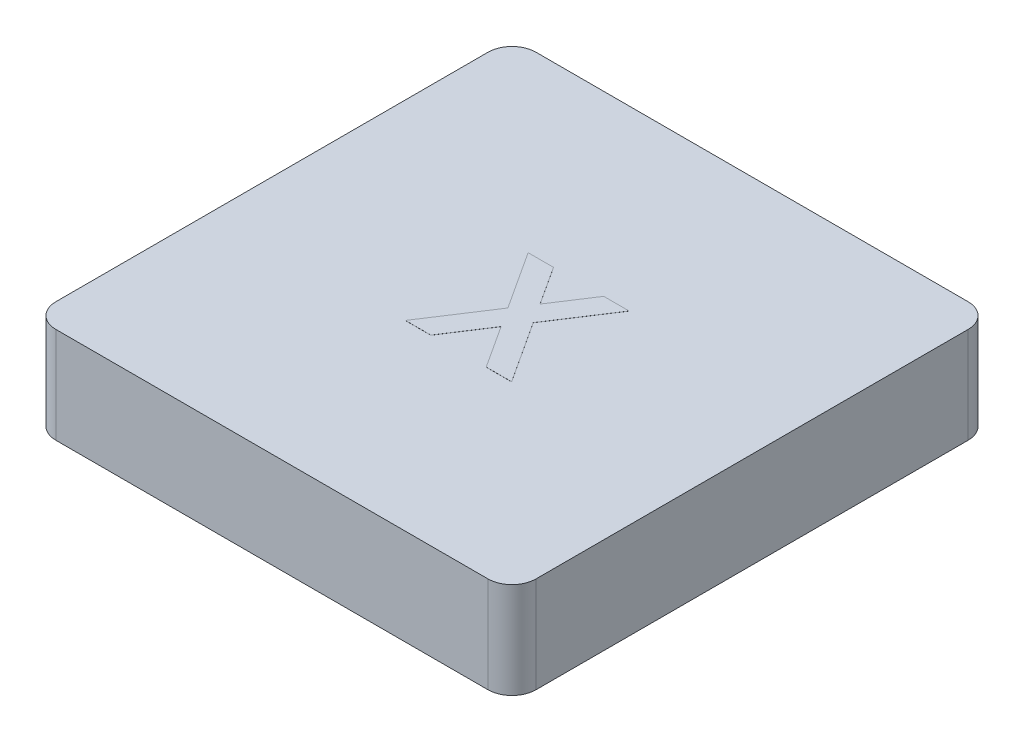
ISO-10303-21;
HEADER;
FILE_DESCRIPTION(('STEP AP214'),'2;1');
FILE_NAME('part.step','',(''),(''),'','','');
FILE_SCHEMA(('AUTOMOTIVE_DESIGN { 1 0 10303 214 1 1 1 1 }'));
ENDSEC;
DATA;
#1=APPLICATION_CONTEXT('core data for automotive mechanical design processes');
#2=APPLICATION_PROTOCOL_DEFINITION('international standard','automotive_design',2000,#1);
#3=PRODUCT_CONTEXT('',#1,'mechanical');
#4=PRODUCT('Part','Part','',(#3));
#5=PRODUCT_RELATED_PRODUCT_CATEGORY('part','',(#4));
#6=PRODUCT_DEFINITION_FORMATION('','',#4);
#7=PRODUCT_DEFINITION_CONTEXT('part definition',#1,'design');
#8=PRODUCT_DEFINITION('design','',#6,#7);
#9=PRODUCT_DEFINITION_SHAPE('','',#8);
#10=(LENGTH_UNIT() NAMED_UNIT(*) SI_UNIT(.MILLI.,.METRE.));
#11=(NAMED_UNIT(*) PLANE_ANGLE_UNIT() SI_UNIT($,.RADIAN.));
#12=(NAMED_UNIT(*) SI_UNIT($,.STERADIAN.) SOLID_ANGLE_UNIT());
#13=UNCERTAINTY_MEASURE_WITH_UNIT(LENGTH_MEASURE(1.E-05),#10,'distance_accuracy_value','');
#14=(GEOMETRIC_REPRESENTATION_CONTEXT(3) GLOBAL_UNCERTAINTY_ASSIGNED_CONTEXT((#13)) GLOBAL_UNIT_ASSIGNED_CONTEXT((#10,
#11,#12)) REPRESENTATION_CONTEXT('',''));
#15=CARTESIAN_POINT('',(0.,0.,0.));
#16=DIRECTION('',(0.,0.,1.));
#17=DIRECTION('',(1.,0.,0.));
#18=AXIS2_PLACEMENT_3D('',#15,#16,#17);
#19=CARTESIAN_POINT('',(0.,2.54,-12.7));
#20=DIRECTION('',(1.,0.,0.));
#21=DIRECTION('',(0.,0.,-1.));
#22=AXIS2_PLACEMENT_3D('',#19,#20,#21);
#23=PLANE('',#22);
#24=DIRECTION('',(0.,0.,1.));
#25=VECTOR('',#24,1.);
#26=CARTESIAN_POINT('',(0.,2.54,-12.7));
#27=LINE('',#26,#25);
#28=CARTESIAN_POINT('',(0.,2.54,-12.065));
#29=VERTEX_POINT('',#28);
#30=CARTESIAN_POINT('',(0.,2.54,-0.635));
#31=VERTEX_POINT('',#30);
#32=EDGE_CURVE('E336',#29,#31,#27,.T.);
#33=ORIENTED_EDGE('',*,*,#32,.F.);
#34=DIRECTION('',(0.,-1.,0.));
#35=VECTOR('',#34,1.);
#36=CARTESIAN_POINT('',(0.,2.54,-12.065));
#37=LINE('',#36,#35);
#38=CARTESIAN_POINT('',(0.,0.,-12.065));
#39=VERTEX_POINT('',#38);
#40=EDGE_CURVE('E361',#29,#39,#37,.T.);
#41=ORIENTED_EDGE('',*,*,#40,.T.);
#42=DIRECTION('',(0.,0.,1.));
#43=VECTOR('',#42,1.);
#44=CARTESIAN_POINT('',(0.,0.,-12.7));
#45=LINE('',#44,#43);
#46=CARTESIAN_POINT('',(0.,0.,-0.635));
#47=VERTEX_POINT('',#46);
#48=EDGE_CURVE('E316',#39,#47,#45,.T.);
#49=ORIENTED_EDGE('',*,*,#48,.T.);
#50=DIRECTION('',(0.,-1.,0.));
#51=VECTOR('',#50,1.);
#52=CARTESIAN_POINT('',(0.,2.54,-0.635));
#53=LINE('',#52,#51);
#54=EDGE_CURVE('E349',#47,#31,#53,.F.);
#55=ORIENTED_EDGE('',*,*,#54,.T.);
#56=EDGE_LOOP('',(#33,#41,#49,#55));
#57=FACE_BOUND('',#56,.T.);
#58=ADVANCED_FACE('F33',(#57),#23,.F.);
#59=CARTESIAN_POINT('',(0.,2.54,0.));
#60=DIRECTION('',(0.,0.,-1.));
#61=DIRECTION('',(-1.,0.,0.));
#62=AXIS2_PLACEMENT_3D('',#59,#60,#61);
#63=PLANE('',#62);
#64=DIRECTION('',(1.,0.,0.));
#65=VECTOR('',#64,1.);
#66=CARTESIAN_POINT('',(0.,0.,0.));
#67=LINE('',#66,#65);
#68=CARTESIAN_POINT('',(0.635,0.,0.));
#69=VERTEX_POINT('',#68);
#70=CARTESIAN_POINT('',(12.065,0.,0.));
#71=VERTEX_POINT('',#70);
#72=EDGE_CURVE('E352',#69,#71,#67,.T.);
#73=ORIENTED_EDGE('',*,*,#72,.T.);
#74=DIRECTION('',(0.,-1.,0.));
#75=VECTOR('',#74,1.);
#76=CARTESIAN_POINT('',(12.065,2.54,0.));
#77=LINE('',#76,#75);
#78=CARTESIAN_POINT('',(12.065,2.54,0.));
#79=VERTEX_POINT('',#78);
#80=EDGE_CURVE('E41',#71,#79,#77,.F.);
#81=ORIENTED_EDGE('',*,*,#80,.T.);
#82=DIRECTION('',(1.,0.,0.));
#83=VECTOR('',#82,1.);
#84=CARTESIAN_POINT('',(0.,2.54,0.));
#85=LINE('',#84,#83);
#86=CARTESIAN_POINT('',(0.635,2.54,0.));
#87=VERTEX_POINT('',#86);
#88=EDGE_CURVE('E339',#87,#79,#85,.T.);
#89=ORIENTED_EDGE('',*,*,#88,.F.);
#90=DIRECTION('',(0.,-1.,0.));
#91=VECTOR('',#90,1.);
#92=CARTESIAN_POINT('',(0.635,2.54,0.));
#93=LINE('',#92,#91);
#94=EDGE_CURVE('E390',#87,#69,#93,.T.);
#95=ORIENTED_EDGE('',*,*,#94,.T.);
#96=EDGE_LOOP('',(#73,#81,#89,#95));
#97=FACE_BOUND('',#96,.T.);
#98=ADVANCED_FACE('F395',(#97),#63,.F.);
#99=CARTESIAN_POINT('',(12.7,2.54,0.));
#100=DIRECTION('',(-1.,0.,0.));
#101=DIRECTION('',(0.,0.,1.));
#102=AXIS2_PLACEMENT_3D('',#99,#100,#101);
#103=PLANE('',#102);
#104=DIRECTION('',(0.,0.,-1.));
#105=VECTOR('',#104,1.);
#106=CARTESIAN_POINT('',(12.7,0.,0.));
#107=LINE('',#106,#105);
#108=CARTESIAN_POINT('',(12.7,0.,-0.635));
#109=VERTEX_POINT('',#108);
#110=CARTESIAN_POINT('',(12.7,0.,-12.065));
#111=VERTEX_POINT('',#110);
#112=EDGE_CURVE('E355',#109,#111,#107,.T.);
#113=ORIENTED_EDGE('',*,*,#112,.T.);
#114=DIRECTION('',(0.,-1.,0.));
#115=VECTOR('',#114,1.);
#116=CARTESIAN_POINT('',(12.7,2.54,-12.065));
#117=LINE('',#116,#115);
#118=CARTESIAN_POINT('',(12.7,2.54,-12.065));
#119=VERTEX_POINT('',#118);
#120=EDGE_CURVE('E388',#111,#119,#117,.F.);
#121=ORIENTED_EDGE('',*,*,#120,.T.);
#122=DIRECTION('',(0.,0.,-1.));
#123=VECTOR('',#122,1.);
#124=CARTESIAN_POINT('',(12.7,2.54,0.));
#125=LINE('',#124,#123);
#126=CARTESIAN_POINT('',(12.7,2.54,-0.635));
#127=VERTEX_POINT('',#126);
#128=EDGE_CURVE('E343',#127,#119,#125,.T.);
#129=ORIENTED_EDGE('',*,*,#128,.F.);
#130=DIRECTION('',(0.,-1.,0.));
#131=VECTOR('',#130,1.);
#132=CARTESIAN_POINT('',(12.7,2.54,-0.635));
#133=LINE('',#132,#131);
#134=EDGE_CURVE('E385',#127,#109,#133,.T.);
#135=ORIENTED_EDGE('',*,*,#134,.T.);
#136=EDGE_LOOP('',(#113,#121,#129,#135));
#137=FACE_BOUND('',#136,.T.);
#138=ADVANCED_FACE('F408',(#137),#103,.F.);
#139=CARTESIAN_POINT('',(12.7,2.54,-12.7));
#140=DIRECTION('',(0.,0.,1.));
#141=DIRECTION('',(1.,0.,0.));
#142=AXIS2_PLACEMENT_3D('',#139,#140,#141);
#143=PLANE('',#142);
#144=DIRECTION('',(-1.,0.,0.));
#145=VECTOR('',#144,1.);
#146=CARTESIAN_POINT('',(12.7,0.,-12.7));
#147=LINE('',#146,#145);
#148=CARTESIAN_POINT('',(12.065,0.,-12.7));
#149=VERTEX_POINT('',#148);
#150=CARTESIAN_POINT('',(0.634999999999995,0.,-12.7));
#151=VERTEX_POINT('',#150);
#152=EDGE_CURVE('E340',#149,#151,#147,.T.);
#153=ORIENTED_EDGE('',*,*,#152,.T.);
#154=DIRECTION('',(0.,-1.,0.));
#155=VECTOR('',#154,1.);
#156=CARTESIAN_POINT('',(0.634999999999995,2.54,-12.7));
#157=LINE('',#156,#155);
#158=CARTESIAN_POINT('',(0.634999999999995,2.54,-12.7));
#159=VERTEX_POINT('',#158);
#160=EDGE_CURVE('E375',#151,#159,#157,.F.);
#161=ORIENTED_EDGE('',*,*,#160,.T.);
#162=DIRECTION('',(-1.,0.,0.));
#163=VECTOR('',#162,1.);
#164=CARTESIAN_POINT('',(12.7,2.54,-12.7));
#165=LINE('',#164,#163);
#166=CARTESIAN_POINT('',(12.065,2.54,-12.7));
#167=VERTEX_POINT('',#166);
#168=EDGE_CURVE('E346',#167,#159,#165,.T.);
#169=ORIENTED_EDGE('',*,*,#168,.F.);
#170=DIRECTION('',(0.,-1.,0.));
#171=VECTOR('',#170,1.);
#172=CARTESIAN_POINT('',(12.065,2.54,-12.7));
#173=LINE('',#172,#171);
#174=EDGE_CURVE('E372',#167,#149,#173,.T.);
#175=ORIENTED_EDGE('',*,*,#174,.T.);
#176=EDGE_LOOP('',(#153,#161,#169,#175));
#177=FACE_BOUND('',#176,.T.);
#178=ADVANCED_FACE('F420',(#177),#143,.F.);
#179=CARTESIAN_POINT('',(0.,2.54,0.));
#180=DIRECTION('',(0.,1.,0.));
#181=DIRECTION('',(0.,0.,1.));
#182=AXIS2_PLACEMENT_3D('',#179,#180,#181);
#183=PLANE('',#182);
#184=DIRECTION('',(-0.54561077963015,0.,-0.838038708623521));
#185=VECTOR('',#184,1.);
#186=CARTESIAN_POINT('',(6.12454447115384,2.54,-6.46628946314103));
#187=LINE('',#186,#185);
#188=CARTESIAN_POINT('',(6.12454447115384,2.54,-6.46628946314103));
#189=VERTEX_POINT('',#188);
#190=CARTESIAN_POINT('',(5.12536077724358,2.54,-8.001));
#191=VERTEX_POINT('',#190);
#192=EDGE_CURVE('E248',#189,#191,#187,.T.);
#193=ORIENTED_EDGE('',*,*,#192,.T.);
#194=DIRECTION('',(1.,0.,0.));
#195=VECTOR('',#194,1.);
#196=CARTESIAN_POINT('',(5.12536077724358,2.54,-8.001));
#197=LINE('',#196,#195);
#198=CARTESIAN_POINT('',(5.7969953926282,2.54,-8.001));
#199=VERTEX_POINT('',#198);
#200=EDGE_CURVE('E199',#191,#199,#197,.T.);
#201=ORIENTED_EDGE('',*,*,#200,.T.);
#202=DIRECTION('',(0.545374257341928,0.,0.838192650545649));
#203=VECTOR('',#202,1.);
#204=CARTESIAN_POINT('',(5.7969953926282,2.54,-8.001));
#205=LINE('',#204,#203);
#206=CARTESIAN_POINT('',(6.46036177884615,2.54,-6.98146374198718));
#207=VERTEX_POINT('',#206);
#208=EDGE_CURVE('E251',#199,#207,#205,.T.);
#209=ORIENTED_EDGE('',*,*,#208,.T.);
#210=DIRECTION('',(0.546108359383021,0.,-0.83771454554161));
#211=VECTOR('',#210,1.);
#212=CARTESIAN_POINT('',(6.46036177884615,2.54,-6.98146374198718));
#213=LINE('',#212,#211);
#214=CARTESIAN_POINT('',(7.12500020032051,2.54,-8.001));
#215=VERTEX_POINT('',#214);
#216=EDGE_CURVE('E253',#207,#215,#213,.T.);
#217=ORIENTED_EDGE('',*,*,#216,.T.);
#218=DIRECTION('',(1.,0.,0.));
#219=VECTOR('',#218,1.);
#220=CARTESIAN_POINT('',(7.12500020032051,2.54,-8.001));
#221=LINE('',#220,#219);
#222=CARTESIAN_POINT('',(7.79727083333333,2.54,-8.001));
#223=VERTEX_POINT('',#222);
#224=EDGE_CURVE('E255',#215,#223,#221,.T.);
#225=ORIENTED_EDGE('',*,*,#224,.T.);
#226=DIRECTION('',(-0.546183097919864,0.,0.837665818537835));
#227=VECTOR('',#226,1.);
#228=CARTESIAN_POINT('',(7.79727083333333,2.54,-8.001));
#229=LINE('',#228,#227);
#230=CARTESIAN_POINT('',(6.79617908653846,2.54,-6.46565344551282));
#231=VERTEX_POINT('',#230);
#232=EDGE_CURVE('E257',#223,#231,#229,.T.);
#233=ORIENTED_EDGE('',*,*,#232,.T.);
#234=DIRECTION('',(0.545513884714244,0.,0.838101784739762));
#235=VECTOR('',#234,1.);
#236=CARTESIAN_POINT('',(6.79617908653846,2.54,-6.46565344551282));
#237=LINE('',#236,#235);
#238=CARTESIAN_POINT('',(7.86341666666666,2.54,-4.826));
#239=VERTEX_POINT('',#238);
#240=EDGE_CURVE('E259',#231,#239,#237,.T.);
#241=ORIENTED_EDGE('',*,*,#240,.T.);
#242=DIRECTION('',(-1.,0.,0.));
#243=VECTOR('',#242,1.);
#244=CARTESIAN_POINT('',(7.86341666666666,2.54,-4.826));
#245=LINE('',#244,#243);
#246=CARTESIAN_POINT('',(7.19178205128205,2.54,-4.826));
#247=VERTEX_POINT('',#246);
#248=EDGE_CURVE('E261',#239,#247,#245,.T.);
#249=ORIENTED_EDGE('',*,*,#248,.T.);
#250=DIRECTION('',(-0.545254971756398,0.,-0.838270252230705));
#251=VECTOR('',#250,1.);
#252=CARTESIAN_POINT('',(7.19178205128205,2.54,-4.826));
#253=LINE('',#252,#251);
#254=CARTESIAN_POINT('',(6.46036177884615,2.54,-5.95047916666667));
#255=VERTEX_POINT('',#254);
#256=EDGE_CURVE('E263',#247,#255,#253,.T.);
#257=ORIENTED_EDGE('',*,*,#256,.T.);
#258=DIRECTION('',(-0.54625332868769,0.,0.837620021786501));
#259=VECTOR('',#258,1.);
#260=CARTESIAN_POINT('',(6.46036177884615,2.54,-5.95047916666667));
#261=LINE('',#260,#259);
#262=CARTESIAN_POINT('',(5.72703345352564,2.54,-4.826));
#263=VERTEX_POINT('',#262);
#264=EDGE_CURVE('E265',#255,#263,#261,.T.);
#265=ORIENTED_EDGE('',*,*,#264,.T.);
#266=DIRECTION('',(-1.,0.,0.));
#267=VECTOR('',#266,1.);
#268=CARTESIAN_POINT('',(5.72703345352564,2.54,-4.826));
#269=LINE('',#268,#267);
#270=CARTESIAN_POINT('',(5.05476282051282,2.54,-4.826));
#271=VERTEX_POINT('',#270);
#272=EDGE_CURVE('E53',#263,#271,#269,.T.);
#273=ORIENTED_EDGE('',*,*,#272,.T.);
#274=DIRECTION('',(0.546277687549728,0.,-0.837604135666319));
#275=VECTOR('',#274,1.);
#276=CARTESIAN_POINT('',(5.05476282051282,2.54,-4.826));
#277=LINE('',#276,#275);
#278=EDGE_CURVE('E48',#271,#189,#277,.T.);
#279=ORIENTED_EDGE('',*,*,#278,.T.);
#280=EDGE_LOOP('',(#193,#201,#209,#217,#225,#233,#241,#249,#257,#265,#273,#279));
#281=FACE_BOUND('',#280,.T.);
#282=ORIENTED_EDGE('',*,*,#168,.T.);
#283=CARTESIAN_POINT('',(0.634999999999995,2.54,-12.065));
#284=DIRECTION('',(0.,1.,0.));
#285=DIRECTION('',(0.,0.,1.));
#286=AXIS2_PLACEMENT_3D('',#283,#284,#285);
#287=CIRCLE('',#286,0.635);
#288=EDGE_CURVE('E383',#159,#29,#287,.T.);
#289=ORIENTED_EDGE('',*,*,#288,.T.);
#290=ORIENTED_EDGE('',*,*,#32,.T.);
#291=CARTESIAN_POINT('',(0.635,2.54,-0.635));
#292=DIRECTION('',(0.,1.,0.));
#293=DIRECTION('',(0.,0.,1.));
#294=AXIS2_PLACEMENT_3D('',#291,#292,#293);
#295=CIRCLE('',#294,0.635);
#296=EDGE_CURVE('E377',#31,#87,#295,.T.);
#297=ORIENTED_EDGE('',*,*,#296,.T.);
#298=ORIENTED_EDGE('',*,*,#88,.T.);
#299=CARTESIAN_POINT('',(12.065,2.54,-0.635));
#300=DIRECTION('',(0.,1.,0.));
#301=DIRECTION('',(0.,0.,1.));
#302=AXIS2_PLACEMENT_3D('',#299,#300,#301);
#303=CIRCLE('',#302,0.635);
#304=EDGE_CURVE('E379',#79,#127,#303,.T.);
#305=ORIENTED_EDGE('',*,*,#304,.T.);
#306=ORIENTED_EDGE('',*,*,#128,.T.);
#307=CARTESIAN_POINT('',(12.065,2.54,-12.065));
#308=DIRECTION('',(0.,1.,0.));
#309=DIRECTION('',(0.,0.,1.));
#310=AXIS2_PLACEMENT_3D('',#307,#308,#309);
#311=CIRCLE('',#310,0.635);
#312=EDGE_CURVE('E381',#119,#167,#311,.T.);
#313=ORIENTED_EDGE('',*,*,#312,.T.);
#314=EDGE_LOOP('',(#282,#289,#290,#297,#298,#305,#306,#313));
#315=FACE_BOUND('',#314,.T.);
#316=ADVANCED_FACE('F401',(#281,#315),#183,.T.);
#317=CARTESIAN_POINT('',(0.,0.,0.));
#318=DIRECTION('',(0.,1.,0.));
#319=DIRECTION('',(0.,0.,1.));
#320=AXIS2_PLACEMENT_3D('',#317,#318,#319);
#321=PLANE('',#320);
#322=DIRECTION('',(-1.,0.,0.));
#323=VECTOR('',#322,1.);
#324=CARTESIAN_POINT('',(12.7,0.,-12.065));
#325=LINE('',#324,#323);
#326=CARTESIAN_POINT('',(12.065,0.,-12.065));
#327=VERTEX_POINT('',#326);
#328=CARTESIAN_POINT('',(0.634999999999995,0.,-12.065));
#329=VERTEX_POINT('',#328);
#330=EDGE_CURVE('E304',#327,#329,#325,.T.);
#331=ORIENTED_EDGE('',*,*,#330,.T.);
#332=DIRECTION('',(0.,0.,1.));
#333=VECTOR('',#332,1.);
#334=CARTESIAN_POINT('',(0.634999999999995,0.,-12.7));
#335=LINE('',#334,#333);
#336=CARTESIAN_POINT('',(0.635,0.,-0.635));
#337=VERTEX_POINT('',#336);
#338=EDGE_CURVE('E299',#329,#337,#335,.T.);
#339=ORIENTED_EDGE('',*,*,#338,.T.);
#340=DIRECTION('',(1.,0.,0.));
#341=VECTOR('',#340,1.);
#342=CARTESIAN_POINT('',(0.,0.,-0.635));
#343=LINE('',#342,#341);
#344=CARTESIAN_POINT('',(12.065,0.,-0.635));
#345=VERTEX_POINT('',#344);
#346=EDGE_CURVE('E328',#337,#345,#343,.T.);
#347=ORIENTED_EDGE('',*,*,#346,.T.);
#348=DIRECTION('',(0.,0.,-1.));
#349=VECTOR('',#348,1.);
#350=CARTESIAN_POINT('',(12.065,0.,0.));
#351=LINE('',#350,#349);
#352=EDGE_CURVE('E331',#345,#327,#351,.T.);
#353=ORIENTED_EDGE('',*,*,#352,.T.);
#354=EDGE_LOOP('',(#331,#339,#347,#353));
#355=FACE_BOUND('',#354,.T.);
#356=ORIENTED_EDGE('',*,*,#48,.F.);
#357=CARTESIAN_POINT('',(0.634999999999995,0.,-12.065));
#358=DIRECTION('',(0.,1.,0.));
#359=DIRECTION('',(0.,0.,1.));
#360=AXIS2_PLACEMENT_3D('',#357,#358,#359);
#361=CIRCLE('',#360,0.635);
#362=EDGE_CURVE('E370',#39,#151,#361,.F.);
#363=ORIENTED_EDGE('',*,*,#362,.T.);
#364=ORIENTED_EDGE('',*,*,#152,.F.);
#365=CARTESIAN_POINT('',(12.065,0.,-12.065));
#366=DIRECTION('',(0.,1.,0.));
#367=DIRECTION('',(0.,0.,1.));
#368=AXIS2_PLACEMENT_3D('',#365,#366,#367);
#369=CIRCLE('',#368,0.635);
#370=EDGE_CURVE('E368',#149,#111,#369,.F.);
#371=ORIENTED_EDGE('',*,*,#370,.T.);
#372=ORIENTED_EDGE('',*,*,#112,.F.);
#373=CARTESIAN_POINT('',(12.065,0.,-0.635));
#374=DIRECTION('',(0.,1.,0.));
#375=DIRECTION('',(0.,0.,1.));
#376=AXIS2_PLACEMENT_3D('',#373,#374,#375);
#377=CIRCLE('',#376,0.635);
#378=EDGE_CURVE('E366',#109,#71,#377,.F.);
#379=ORIENTED_EDGE('',*,*,#378,.T.);
#380=ORIENTED_EDGE('',*,*,#72,.F.);
#381=CARTESIAN_POINT('',(0.635,0.,-0.635));
#382=DIRECTION('',(0.,1.,0.));
#383=DIRECTION('',(0.,0.,1.));
#384=AXIS2_PLACEMENT_3D('',#381,#382,#383);
#385=CIRCLE('',#384,0.635);
#386=EDGE_CURVE('E364',#69,#47,#385,.F.);
#387=ORIENTED_EDGE('',*,*,#386,.T.);
#388=EDGE_LOOP('',(#356,#363,#364,#371,#372,#379,#380,#387));
#389=FACE_BOUND('',#388,.T.);
#390=ADVANCED_FACE('F412',(#355,#389),#321,.F.);
#391=CARTESIAN_POINT('',(0.634999999999995,2.54,-12.065));
#392=DIRECTION('',(0.,-1.,0.));
#393=DIRECTION('',(0.,0.,-1.));
#394=AXIS2_PLACEMENT_3D('',#391,#392,#393);
#395=CYLINDRICAL_SURFACE('',#394,0.635);
#396=ORIENTED_EDGE('',*,*,#288,.F.);
#397=ORIENTED_EDGE('',*,*,#160,.F.);
#398=ORIENTED_EDGE('',*,*,#362,.F.);
#399=ORIENTED_EDGE('',*,*,#40,.F.);
#400=EDGE_LOOP('',(#396,#397,#398,#399));
#401=FACE_BOUND('',#400,.T.);
#402=ADVANCED_FACE('F426',(#401),#395,.T.);
#403=CARTESIAN_POINT('',(12.065,2.54,-12.065));
#404=DIRECTION('',(0.,-1.,0.));
#405=DIRECTION('',(0.,0.,-1.));
#406=AXIS2_PLACEMENT_3D('',#403,#404,#405);
#407=CYLINDRICAL_SURFACE('',#406,0.635);
#408=ORIENTED_EDGE('',*,*,#312,.F.);
#409=ORIENTED_EDGE('',*,*,#120,.F.);
#410=ORIENTED_EDGE('',*,*,#370,.F.);
#411=ORIENTED_EDGE('',*,*,#174,.F.);
#412=EDGE_LOOP('',(#408,#409,#410,#411));
#413=FACE_BOUND('',#412,.T.);
#414=ADVANCED_FACE('F417',(#413),#407,.T.);
#415=CARTESIAN_POINT('',(12.065,2.54,-0.635));
#416=DIRECTION('',(0.,-1.,0.));
#417=DIRECTION('',(0.,0.,-1.));
#418=AXIS2_PLACEMENT_3D('',#415,#416,#417);
#419=CYLINDRICAL_SURFACE('',#418,0.635);
#420=ORIENTED_EDGE('',*,*,#304,.F.);
#421=ORIENTED_EDGE('',*,*,#80,.F.);
#422=ORIENTED_EDGE('',*,*,#378,.F.);
#423=ORIENTED_EDGE('',*,*,#134,.F.);
#424=EDGE_LOOP('',(#420,#421,#422,#423));
#425=FACE_BOUND('',#424,.T.);
#426=ADVANCED_FACE('F405',(#425),#419,.T.);
#427=CARTESIAN_POINT('',(0.635,2.54,-0.635));
#428=DIRECTION('',(0.,-1.,0.));
#429=DIRECTION('',(0.,0.,-1.));
#430=AXIS2_PLACEMENT_3D('',#427,#428,#429);
#431=CYLINDRICAL_SURFACE('',#430,0.635);
#432=ORIENTED_EDGE('',*,*,#296,.F.);
#433=ORIENTED_EDGE('',*,*,#54,.F.);
#434=ORIENTED_EDGE('',*,*,#386,.F.);
#435=ORIENTED_EDGE('',*,*,#94,.F.);
#436=EDGE_LOOP('',(#432,#433,#434,#435));
#437=FACE_BOUND('',#436,.T.);
#438=ADVANCED_FACE('F35',(#437),#431,.T.);
#439=CARTESIAN_POINT('',(0.634999999999995,2.54,-12.7));
#440=DIRECTION('',(1.,0.,0.));
#441=DIRECTION('',(0.,0.,-1.));
#442=AXIS2_PLACEMENT_3D('',#439,#440,#441);
#443=PLANE('',#442);
#444=DIRECTION('',(0.,0.,1.));
#445=VECTOR('',#444,1.);
#446=CARTESIAN_POINT('',(0.634999999999995,1.905,-12.7));
#447=LINE('',#446,#445);
#448=CARTESIAN_POINT('',(0.634999999999995,1.905,-12.065));
#449=VERTEX_POINT('',#448);
#450=CARTESIAN_POINT('',(0.635,1.905,-0.635));
#451=VERTEX_POINT('',#450);
#452=EDGE_CURVE('E300',#449,#451,#447,.T.);
#453=ORIENTED_EDGE('',*,*,#452,.T.);
#454=DIRECTION('',(0.,1.,0.));
#455=VECTOR('',#454,1.);
#456=CARTESIAN_POINT('',(0.635,2.54,-0.635));
#457=LINE('',#456,#455);
#458=EDGE_CURVE('E309',#337,#451,#457,.T.);
#459=ORIENTED_EDGE('',*,*,#458,.F.);
#460=ORIENTED_EDGE('',*,*,#338,.F.);
#461=DIRECTION('',(0.,1.,0.));
#462=VECTOR('',#461,1.);
#463=CARTESIAN_POINT('',(0.634999999999995,2.54,-12.065));
#464=LINE('',#463,#462);
#465=EDGE_CURVE('E305',#329,#449,#464,.T.);
#466=ORIENTED_EDGE('',*,*,#465,.T.);
#467=EDGE_LOOP('',(#453,#459,#460,#466));
#468=FACE_BOUND('',#467,.T.);
#469=ADVANCED_FACE('F431',(#468),#443,.T.);
#470=CARTESIAN_POINT('',(0.,2.54,-0.635));
#471=DIRECTION('',(0.,0.,-1.));
#472=DIRECTION('',(-1.,0.,0.));
#473=AXIS2_PLACEMENT_3D('',#470,#471,#472);
#474=PLANE('',#473);
#475=ORIENTED_EDGE('',*,*,#346,.F.);
#476=ORIENTED_EDGE('',*,*,#458,.T.);
#477=DIRECTION('',(1.,0.,0.));
#478=VECTOR('',#477,1.);
#479=CARTESIAN_POINT('',(0.,1.905,-0.635));
#480=LINE('',#479,#478);
#481=CARTESIAN_POINT('',(12.065,1.905,-0.635));
#482=VERTEX_POINT('',#481);
#483=EDGE_CURVE('E303',#451,#482,#480,.T.);
#484=ORIENTED_EDGE('',*,*,#483,.T.);
#485=DIRECTION('',(0.,1.,0.));
#486=VECTOR('',#485,1.);
#487=CARTESIAN_POINT('',(12.065,2.54,-0.635));
#488=LINE('',#487,#486);
#489=EDGE_CURVE('E313',#345,#482,#488,.T.);
#490=ORIENTED_EDGE('',*,*,#489,.F.);
#491=EDGE_LOOP('',(#475,#476,#484,#490));
#492=FACE_BOUND('',#491,.T.);
#493=ADVANCED_FACE('F436',(#492),#474,.T.);
#494=CARTESIAN_POINT('',(12.065,2.54,0.));
#495=DIRECTION('',(-1.,0.,0.));
#496=DIRECTION('',(0.,0.,1.));
#497=AXIS2_PLACEMENT_3D('',#494,#495,#496);
#498=PLANE('',#497);
#499=ORIENTED_EDGE('',*,*,#352,.F.);
#500=ORIENTED_EDGE('',*,*,#489,.T.);
#501=DIRECTION('',(0.,0.,-1.));
#502=VECTOR('',#501,1.);
#503=CARTESIAN_POINT('',(12.065,1.905,0.));
#504=LINE('',#503,#502);
#505=CARTESIAN_POINT('',(12.065,1.905,-12.065));
#506=VERTEX_POINT('',#505);
#507=EDGE_CURVE('E319',#482,#506,#504,.T.);
#508=ORIENTED_EDGE('',*,*,#507,.T.);
#509=DIRECTION('',(0.,1.,0.));
#510=VECTOR('',#509,1.);
#511=CARTESIAN_POINT('',(12.065,2.54,-12.065));
#512=LINE('',#511,#510);
#513=EDGE_CURVE('E308',#327,#506,#512,.T.);
#514=ORIENTED_EDGE('',*,*,#513,.F.);
#515=EDGE_LOOP('',(#499,#500,#508,#514));
#516=FACE_BOUND('',#515,.T.);
#517=ADVANCED_FACE('F489',(#516),#498,.T.);
#518=CARTESIAN_POINT('',(12.7,2.54,-12.065));
#519=DIRECTION('',(0.,0.,1.));
#520=DIRECTION('',(1.,0.,0.));
#521=AXIS2_PLACEMENT_3D('',#518,#519,#520);
#522=PLANE('',#521);
#523=ORIENTED_EDGE('',*,*,#330,.F.);
#524=ORIENTED_EDGE('',*,*,#513,.T.);
#525=DIRECTION('',(-1.,0.,0.));
#526=VECTOR('',#525,1.);
#527=CARTESIAN_POINT('',(12.7,1.905,-12.065));
#528=LINE('',#527,#526);
#529=EDGE_CURVE('E312',#506,#449,#528,.T.);
#530=ORIENTED_EDGE('',*,*,#529,.T.);
#531=ORIENTED_EDGE('',*,*,#465,.F.);
#532=EDGE_LOOP('',(#523,#524,#530,#531));
#533=FACE_BOUND('',#532,.T.);
#534=ADVANCED_FACE('F499',(#533),#522,.T.);
#535=CARTESIAN_POINT('',(0.,1.905,0.));
#536=DIRECTION('',(0.,1.,0.));
#537=DIRECTION('',(0.,0.,1.));
#538=AXIS2_PLACEMENT_3D('',#535,#536,#537);
#539=PLANE('',#538);
#540=CARTESIAN_POINT('',(6.34999999999999,1.905,-6.35));
#541=DIRECTION('',(0.,1.,0.));
#542=DIRECTION('',(0.,0.,1.));
#543=AXIS2_PLACEMENT_3D('',#540,#541,#542);
#544=CIRCLE('',#543,2.54);
#545=CARTESIAN_POINT('',(6.34999999999999,1.905,-3.81));
#546=VERTEX_POINT('',#545);
#547=EDGE_CURVE('E11',#546,#546,#544,.F.);
#548=ORIENTED_EDGE('',*,*,#547,.F.);
#549=EDGE_LOOP('',(#548));
#550=FACE_BOUND('',#549,.T.);
#551=ORIENTED_EDGE('',*,*,#529,.F.);
#552=ORIENTED_EDGE('',*,*,#507,.F.);
#553=ORIENTED_EDGE('',*,*,#483,.F.);
#554=ORIENTED_EDGE('',*,*,#452,.F.);
#555=EDGE_LOOP('',(#551,#552,#553,#554));
#556=FACE_BOUND('',#555,.T.);
#557=ADVANCED_FACE('F509',(#550,#556),#539,.F.);
#558=CARTESIAN_POINT('',(6.34999999999999,-7.18420489685532,-6.35));
#559=DIRECTION('',(0.,1.,0.));
#560=DIRECTION('',(0.,0.,1.));
#561=AXIS2_PLACEMENT_3D('',#558,#559,#560);
#562=CYLINDRICAL_SURFACE('',#561,2.54);
#563=CARTESIAN_POINT('',(6.34999999999999,0.,-6.35));
#564=DIRECTION('',(0.,1.,0.));
#565=DIRECTION('',(0.,0.,1.));
#566=AXIS2_PLACEMENT_3D('',#563,#564,#565);
#567=CIRCLE('',#566,2.54);
#568=CARTESIAN_POINT('',(6.34999999999999,0.,-3.81));
#569=VERTEX_POINT('',#568);
#570=EDGE_CURVE('E269',#569,#569,#567,.T.);
#571=CARTESIAN_POINT('',(6.34999999999999,0.,-3.81));
#572=CARTESIAN_POINT('',(6.34999999999999,0.0198437499999991,-3.81));
#573=CARTESIAN_POINT('',(6.34999999999999,0.0396874999999989,-3.81));
#574=CARTESIAN_POINT('',(6.34999999999999,0.079374999999999,-3.81));
#575=CARTESIAN_POINT('',(6.34999999999999,0.0992187499999992,-3.81));
#576=CARTESIAN_POINT('',(6.34999999999999,0.138906249999999,-3.81));
#577=CARTESIAN_POINT('',(6.34999999999999,0.158749999999999,-3.81));
#578=CARTESIAN_POINT('',(6.34999999999999,0.198437499999999,-3.81));
#579=CARTESIAN_POINT('',(6.34999999999999,0.218281249999999,-3.81));
#580=CARTESIAN_POINT('',(6.34999999999999,0.25796875,-3.81));
#581=CARTESIAN_POINT('',(6.34999999999999,0.277812499999999,-3.81));
#582=CARTESIAN_POINT('',(6.34999999999999,0.317499999999999,-3.81));
#583=CARTESIAN_POINT('',(6.34999999999999,0.337343749999999,-3.81));
#584=CARTESIAN_POINT('',(6.34999999999999,0.377031249999999,-3.81));
#585=CARTESIAN_POINT('',(6.34999999999999,0.396874999999999,-3.81));
#586=CARTESIAN_POINT('',(6.34999999999999,0.436562499999999,-3.81));
#587=CARTESIAN_POINT('',(6.34999999999999,0.456406249999999,-3.81));
#588=CARTESIAN_POINT('',(6.34999999999999,0.496093749999999,-3.81));
#589=CARTESIAN_POINT('',(6.34999999999999,0.515937499999999,-3.81));
#590=CARTESIAN_POINT('',(6.34999999999999,0.555624999999999,-3.81));
#591=CARTESIAN_POINT('',(6.34999999999999,0.575468749999999,-3.81));
#592=CARTESIAN_POINT('',(6.34999999999999,0.615156249999999,-3.81));
#593=CARTESIAN_POINT('',(6.34999999999999,0.634999999999999,-3.81));
#594=CARTESIAN_POINT('',(6.34999999999999,0.674687499999998,-3.81));
#595=CARTESIAN_POINT('',(6.34999999999999,0.694531249999998,-3.81));
#596=CARTESIAN_POINT('',(6.34999999999999,0.734218749999998,-3.81));
#597=CARTESIAN_POINT('',(6.34999999999999,0.754062499999998,-3.81));
#598=CARTESIAN_POINT('',(6.34999999999999,0.793749999999998,-3.81));
#599=CARTESIAN_POINT('',(6.34999999999999,0.813593749999999,-3.81));
#600=CARTESIAN_POINT('',(6.34999999999999,0.853281249999999,-3.81));
#601=CARTESIAN_POINT('',(6.34999999999999,0.873124999999999,-3.81));
#602=CARTESIAN_POINT('',(6.34999999999999,0.912812499999999,-3.81));
#603=CARTESIAN_POINT('',(6.34999999999999,0.932656249999999,-3.81));
#604=CARTESIAN_POINT('',(6.34999999999999,0.972343749999998,-3.81));
#605=CARTESIAN_POINT('',(6.34999999999999,0.992187499999998,-3.81));
#606=CARTESIAN_POINT('',(6.34999999999999,1.031875,-3.81));
#607=CARTESIAN_POINT('',(6.34999999999999,1.05171875,-3.81));
#608=CARTESIAN_POINT('',(6.34999999999999,1.09140625,-3.81));
#609=CARTESIAN_POINT('',(6.34999999999999,1.11125,-3.81));
#610=CARTESIAN_POINT('',(6.34999999999999,1.1509375,-3.81));
#611=CARTESIAN_POINT('',(6.34999999999999,1.17078125,-3.81));
#612=CARTESIAN_POINT('',(6.34999999999999,1.21046875,-3.81));
#613=CARTESIAN_POINT('',(6.34999999999999,1.2303125,-3.81));
#614=CARTESIAN_POINT('',(6.34999999999999,1.27,-3.81));
#615=CARTESIAN_POINT('',(6.34999999999999,1.28984375,-3.81));
#616=CARTESIAN_POINT('',(6.34999999999999,1.32953125,-3.81));
#617=CARTESIAN_POINT('',(6.34999999999999,1.349375,-3.81));
#618=CARTESIAN_POINT('',(6.34999999999999,1.3890625,-3.81));
#619=CARTESIAN_POINT('',(6.34999999999999,1.40890625,-3.81));
#620=CARTESIAN_POINT('',(6.34999999999999,1.44859375,-3.81));
#621=CARTESIAN_POINT('',(6.34999999999999,1.4684375,-3.81));
#622=CARTESIAN_POINT('',(6.34999999999999,1.508125,-3.81));
#623=CARTESIAN_POINT('',(6.34999999999999,1.52796875,-3.81));
#624=CARTESIAN_POINT('',(6.34999999999999,1.56765625,-3.81));
#625=CARTESIAN_POINT('',(6.34999999999999,1.5875,-3.81));
#626=CARTESIAN_POINT('',(6.34999999999999,1.6271875,-3.81));
#627=CARTESIAN_POINT('',(6.34999999999999,1.64703125,-3.81));
#628=CARTESIAN_POINT('',(6.34999999999999,1.68671875,-3.81));
#629=CARTESIAN_POINT('',(6.34999999999999,1.7065625,-3.81));
#630=CARTESIAN_POINT('',(6.34999999999999,1.74625,-3.81));
#631=CARTESIAN_POINT('',(6.34999999999999,1.76609375,-3.81));
#632=CARTESIAN_POINT('',(6.34999999999999,1.80578125,-3.81));
#633=CARTESIAN_POINT('',(6.34999999999999,1.825625,-3.81));
#634=CARTESIAN_POINT('',(6.34999999999999,1.8653125,-3.81));
#635=CARTESIAN_POINT('',(6.34999999999999,1.88515625,-3.81));
#636=CARTESIAN_POINT('',(6.34999999999999,1.905,-3.81));
#637=B_SPLINE_CURVE_WITH_KNOTS('',3,(#571,#572,#573,#574,#575,#576,#577,#578,#579,#580,#581,
#582,#583,#584,#585,#586,#587,#588,#589,#590,#591,#592,#593,#594,#595,#596,#597,#598,#599,#600,
#601,#602,#603,#604,#605,#606,#607,#608,#609,#610,#611,#612,#613,#614,#615,#616,#617,#618,#619,
#620,#621,#622,#623,#624,#625,#626,#627,#628,#629,#630,#631,#632,#633,#634,#635,#636),
.UNSPECIFIED.,.F.,.F.,(4,2,2,2,2,2,2,2,2,2,2,2,2,2,2,2,2,2,2,2,2,2,2,2,2,2,2,2,2,2,2,2,4),(0.,
0.0595312499999997,0.1190625,0.17859375,0.238125,0.29765625,0.3571875,0.41671875,0.47625,
0.53578125,0.5953125,0.654843749999999,0.714374999999999,0.773906249999999,0.8334375,0.89296875,
0.952499999999999,1.01203125,1.0715625,1.13109375,1.190625,1.25015625,1.3096875,1.36921875,
1.42875,1.48828125,1.5478125,1.60734375,1.666875,1.72640625,1.7859375,1.84546875,1.905),.UNSPECIFIED.);
#638=EDGE_CURVE('BSEAM519',#569,#546,#637,.T.);
#639=ORIENTED_EDGE('',*,*,#570,.T.);
#640=ORIENTED_EDGE('',*,*,#547,.T.);
#641=ORIENTED_EDGE('',*,*,#638,.T.);
#642=ORIENTED_EDGE('',*,*,#638,.F.);
#643=EDGE_LOOP('',(#639,#641,#640,#642));
#644=FACE_BOUND('',#643,.T.);
#645=ADVANCED_FACE('F519',(#644),#562,.T.);
#646=CARTESIAN_POINT('',(0.,0.,0.));
#647=DIRECTION('',(0.,1.,0.));
#648=DIRECTION('',(0.,0.,1.));
#649=AXIS2_PLACEMENT_3D('',#646,#647,#648);
#650=PLANE('',#649);
#651=ORIENTED_EDGE('',*,*,#570,.F.);
#652=EDGE_LOOP('',(#651));
#653=FACE_BOUND('',#652,.T.);
#654=ADVANCED_FACE('F529',(#653),#650,.F.);
#655=CARTESIAN_POINT('',(6.12454447115384,2.54254,-6.46628946314103));
#656=DIRECTION('',(-0.838038708623521,0.,0.54561077963015));
#657=DIRECTION('',(0.54561077963015,0.,0.838038708623521));
#658=AXIS2_PLACEMENT_3D('',#655,#656,#657);
#659=PLANE('',#658);
#660=ORIENTED_EDGE('',*,*,#192,.F.);
#661=DIRECTION('',(0.,-1.,0.));
#662=VECTOR('',#661,1.);
#663=CARTESIAN_POINT('',(6.12454447115384,2.54254,-6.46628946314103));
#664=LINE('',#663,#662);
#665=CARTESIAN_POINT('',(6.12454447115384,2.54254,-6.46628946314103));
#666=VERTEX_POINT('',#665);
#667=EDGE_CURVE('E218',#666,#189,#664,.T.);
#668=ORIENTED_EDGE('',*,*,#667,.F.);
#669=DIRECTION('',(-0.54561077963015,0.,-0.838038708623521));
#670=VECTOR('',#669,1.);
#671=CARTESIAN_POINT('',(6.12454447115384,2.54254,-6.46628946314103));
#672=LINE('',#671,#670);
#673=CARTESIAN_POINT('',(5.12536077724358,2.54254,-8.001));
#674=VERTEX_POINT('',#673);
#675=EDGE_CURVE('E211',#666,#674,#672,.T.);
#676=ORIENTED_EDGE('',*,*,#675,.T.);
#677=DIRECTION('',(0.,-1.,0.));
#678=VECTOR('',#677,1.);
#679=CARTESIAN_POINT('',(5.12536077724358,2.54254,-8.001));
#680=LINE('',#679,#678);
#681=EDGE_CURVE('E194',#674,#191,#680,.T.);
#682=ORIENTED_EDGE('',*,*,#681,.T.);
#683=EDGE_LOOP('',(#660,#668,#676,#682));
#684=FACE_BOUND('',#683,.T.);
#685=ADVANCED_FACE('F217',(#684),#659,.T.);
#686=CARTESIAN_POINT('',(5.05476282051282,2.54254,-4.826));
#687=DIRECTION('',(-0.837604135666319,0.,-0.546277687549728));
#688=DIRECTION('',(-0.546277687549728,0.,0.837604135666319));
#689=AXIS2_PLACEMENT_3D('',#686,#687,#688);
#690=PLANE('',#689);
#691=ORIENTED_EDGE('',*,*,#278,.F.);
#692=DIRECTION('',(0.,-1.,0.));
#693=VECTOR('',#692,1.);
#694=CARTESIAN_POINT('',(5.05476282051282,2.54254,-4.826));
#695=LINE('',#694,#693);
#696=CARTESIAN_POINT('',(5.05476282051282,2.54254,-4.826));
#697=VERTEX_POINT('',#696);
#698=EDGE_CURVE('E270',#697,#271,#695,.T.);
#699=ORIENTED_EDGE('',*,*,#698,.F.);
#700=DIRECTION('',(0.546277687549728,0.,-0.837604135666319));
#701=VECTOR('',#700,1.);
#702=CARTESIAN_POINT('',(5.05476282051282,2.54254,-4.826));
#703=LINE('',#702,#701);
#704=EDGE_CURVE('E204',#697,#666,#703,.T.);
#705=ORIENTED_EDGE('',*,*,#704,.T.);
#706=ORIENTED_EDGE('',*,*,#667,.T.);
#707=EDGE_LOOP('',(#691,#699,#705,#706));
#708=FACE_BOUND('',#707,.T.);
#709=ADVANCED_FACE('F556',(#708),#690,.T.);
#710=CARTESIAN_POINT('',(5.72703345352564,2.54254,-4.826));
#711=DIRECTION('',(0.,0.,1.));
#712=DIRECTION('',(1.,0.,0.));
#713=AXIS2_PLACEMENT_3D('',#710,#711,#712);
#714=PLANE('',#713);
#715=ORIENTED_EDGE('',*,*,#272,.F.);
#716=DIRECTION('',(0.,-1.,0.));
#717=VECTOR('',#716,1.);
#718=CARTESIAN_POINT('',(5.72703345352564,2.54254,-4.826));
#719=LINE('',#718,#717);
#720=CARTESIAN_POINT('',(5.72703345352564,2.54254,-4.826));
#721=VERTEX_POINT('',#720);
#722=EDGE_CURVE('E272',#721,#263,#719,.T.);
#723=ORIENTED_EDGE('',*,*,#722,.F.);
#724=DIRECTION('',(-1.,0.,0.));
#725=VECTOR('',#724,1.);
#726=CARTESIAN_POINT('',(5.72703345352564,2.54254,-4.826));
#727=LINE('',#726,#725);
#728=EDGE_CURVE('E244',#721,#697,#727,.T.);
#729=ORIENTED_EDGE('',*,*,#728,.T.);
#730=ORIENTED_EDGE('',*,*,#698,.T.);
#731=EDGE_LOOP('',(#715,#723,#729,#730));
#732=FACE_BOUND('',#731,.T.);
#733=ADVANCED_FACE('F565',(#732),#714,.T.);
#734=CARTESIAN_POINT('',(6.46036177884615,2.54254,-5.95047916666667));
#735=DIRECTION('',(0.837620021786501,0.,0.54625332868769));
#736=DIRECTION('',(0.54625332868769,0.,-0.837620021786501));
#737=AXIS2_PLACEMENT_3D('',#734,#735,#736);
#738=PLANE('',#737);
#739=ORIENTED_EDGE('',*,*,#264,.F.);
#740=DIRECTION('',(0.,-1.,0.));
#741=VECTOR('',#740,1.);
#742=CARTESIAN_POINT('',(6.46036177884615,2.54254,-5.95047916666667));
#743=LINE('',#742,#741);
#744=CARTESIAN_POINT('',(6.46036177884615,2.54254,-5.95047916666667));
#745=VERTEX_POINT('',#744);
#746=EDGE_CURVE('E275',#745,#255,#743,.T.);
#747=ORIENTED_EDGE('',*,*,#746,.F.);
#748=DIRECTION('',(-0.54625332868769,0.,0.837620021786501));
#749=VECTOR('',#748,1.);
#750=CARTESIAN_POINT('',(6.46036177884615,2.54254,-5.95047916666667));
#751=LINE('',#750,#749);
#752=EDGE_CURVE('E241',#745,#721,#751,.T.);
#753=ORIENTED_EDGE('',*,*,#752,.T.);
#754=ORIENTED_EDGE('',*,*,#722,.T.);
#755=EDGE_LOOP('',(#739,#747,#753,#754));
#756=FACE_BOUND('',#755,.T.);
#757=ADVANCED_FACE('F575',(#756),#738,.T.);
#758=CARTESIAN_POINT('',(7.19178205128205,2.54254,-4.826));
#759=DIRECTION('',(-0.838270252230705,0.,0.545254971756398));
#760=DIRECTION('',(0.545254971756398,0.,0.838270252230705));
#761=AXIS2_PLACEMENT_3D('',#758,#759,#760);
#762=PLANE('',#761);
#763=ORIENTED_EDGE('',*,*,#256,.F.);
#764=DIRECTION('',(0.,-1.,0.));
#765=VECTOR('',#764,1.);
#766=CARTESIAN_POINT('',(7.19178205128205,2.54254,-4.826));
#767=LINE('',#766,#765);
#768=CARTESIAN_POINT('',(7.19178205128205,2.54254,-4.826));
#769=VERTEX_POINT('',#768);
#770=EDGE_CURVE('E278',#769,#247,#767,.T.);
#771=ORIENTED_EDGE('',*,*,#770,.F.);
#772=DIRECTION('',(-0.545254971756398,0.,-0.838270252230705));
#773=VECTOR('',#772,1.);
#774=CARTESIAN_POINT('',(7.19178205128205,2.54254,-4.826));
#775=LINE('',#774,#773);
#776=EDGE_CURVE('E238',#769,#745,#775,.T.);
#777=ORIENTED_EDGE('',*,*,#776,.T.);
#778=ORIENTED_EDGE('',*,*,#746,.T.);
#779=EDGE_LOOP('',(#763,#771,#777,#778));
#780=FACE_BOUND('',#779,.T.);
#781=ADVANCED_FACE('F585',(#780),#762,.T.);
#782=CARTESIAN_POINT('',(7.86341666666666,2.54254,-4.826));
#783=DIRECTION('',(0.,0.,1.));
#784=DIRECTION('',(1.,0.,0.));
#785=AXIS2_PLACEMENT_3D('',#782,#783,#784);
#786=PLANE('',#785);
#787=ORIENTED_EDGE('',*,*,#248,.F.);
#788=DIRECTION('',(0.,-1.,0.));
#789=VECTOR('',#788,1.);
#790=CARTESIAN_POINT('',(7.86341666666666,2.54254,-4.826));
#791=LINE('',#790,#789);
#792=CARTESIAN_POINT('',(7.86341666666666,2.54254,-4.826));
#793=VERTEX_POINT('',#792);
#794=EDGE_CURVE('E281',#793,#239,#791,.T.);
#795=ORIENTED_EDGE('',*,*,#794,.F.);
#796=DIRECTION('',(-1.,0.,0.));
#797=VECTOR('',#796,1.);
#798=CARTESIAN_POINT('',(7.86341666666666,2.54254,-4.826));
#799=LINE('',#798,#797);
#800=EDGE_CURVE('E235',#793,#769,#799,.T.);
#801=ORIENTED_EDGE('',*,*,#800,.T.);
#802=ORIENTED_EDGE('',*,*,#770,.T.);
#803=EDGE_LOOP('',(#787,#795,#801,#802));
#804=FACE_BOUND('',#803,.T.);
#805=ADVANCED_FACE('F595',(#804),#786,.T.);
#806=CARTESIAN_POINT('',(6.79617908653846,2.54254,-6.46565344551282));
#807=DIRECTION('',(0.838101784739762,0.,-0.545513884714244));
#808=DIRECTION('',(-0.545513884714244,0.,-0.838101784739762));
#809=AXIS2_PLACEMENT_3D('',#806,#807,#808);
#810=PLANE('',#809);
#811=ORIENTED_EDGE('',*,*,#240,.F.);
#812=DIRECTION('',(0.,-1.,0.));
#813=VECTOR('',#812,1.);
#814=CARTESIAN_POINT('',(6.79617908653846,2.54254,-6.46565344551282));
#815=LINE('',#814,#813);
#816=CARTESIAN_POINT('',(6.79617908653846,2.54254,-6.46565344551282));
#817=VERTEX_POINT('',#816);
#818=EDGE_CURVE('E284',#817,#231,#815,.T.);
#819=ORIENTED_EDGE('',*,*,#818,.F.);
#820=DIRECTION('',(0.545513884714244,0.,0.838101784739762));
#821=VECTOR('',#820,1.);
#822=CARTESIAN_POINT('',(6.79617908653846,2.54254,-6.46565344551282));
#823=LINE('',#822,#821);
#824=EDGE_CURVE('E232',#817,#793,#823,.T.);
#825=ORIENTED_EDGE('',*,*,#824,.T.);
#826=ORIENTED_EDGE('',*,*,#794,.T.);
#827=EDGE_LOOP('',(#811,#819,#825,#826));
#828=FACE_BOUND('',#827,.T.);
#829=ADVANCED_FACE('F605',(#828),#810,.T.);
#830=CARTESIAN_POINT('',(7.79727083333333,2.54254,-8.001));
#831=DIRECTION('',(0.837665818537835,0.,0.546183097919864));
#832=DIRECTION('',(0.546183097919864,0.,-0.837665818537835));
#833=AXIS2_PLACEMENT_3D('',#830,#831,#832);
#834=PLANE('',#833);
#835=ORIENTED_EDGE('',*,*,#232,.F.);
#836=DIRECTION('',(0.,-1.,0.));
#837=VECTOR('',#836,1.);
#838=CARTESIAN_POINT('',(7.79727083333333,2.54254,-8.001));
#839=LINE('',#838,#837);
#840=CARTESIAN_POINT('',(7.79727083333333,2.54254,-8.001));
#841=VERTEX_POINT('',#840);
#842=EDGE_CURVE('E287',#841,#223,#839,.T.);
#843=ORIENTED_EDGE('',*,*,#842,.F.);
#844=DIRECTION('',(-0.546183097919864,0.,0.837665818537835));
#845=VECTOR('',#844,1.);
#846=CARTESIAN_POINT('',(7.79727083333333,2.54254,-8.001));
#847=LINE('',#846,#845);
#848=EDGE_CURVE('E229',#841,#817,#847,.T.);
#849=ORIENTED_EDGE('',*,*,#848,.T.);
#850=ORIENTED_EDGE('',*,*,#818,.T.);
#851=EDGE_LOOP('',(#835,#843,#849,#850));
#852=FACE_BOUND('',#851,.T.);
#853=ADVANCED_FACE('F615',(#852),#834,.T.);
#854=CARTESIAN_POINT('',(7.12500020032051,2.54254,-8.001));
#855=DIRECTION('',(0.,0.,-1.));
#856=DIRECTION('',(-1.,0.,0.));
#857=AXIS2_PLACEMENT_3D('',#854,#855,#856);
#858=PLANE('',#857);
#859=ORIENTED_EDGE('',*,*,#224,.F.);
#860=DIRECTION('',(0.,-1.,0.));
#861=VECTOR('',#860,1.);
#862=CARTESIAN_POINT('',(7.12500020032051,2.54254,-8.001));
#863=LINE('',#862,#861);
#864=CARTESIAN_POINT('',(7.12500020032051,2.54254,-8.001));
#865=VERTEX_POINT('',#864);
#866=EDGE_CURVE('E290',#865,#215,#863,.T.);
#867=ORIENTED_EDGE('',*,*,#866,.F.);
#868=DIRECTION('',(1.,0.,0.));
#869=VECTOR('',#868,1.);
#870=CARTESIAN_POINT('',(7.12500020032051,2.54254,-8.001));
#871=LINE('',#870,#869);
#872=EDGE_CURVE('E226',#865,#841,#871,.T.);
#873=ORIENTED_EDGE('',*,*,#872,.T.);
#874=ORIENTED_EDGE('',*,*,#842,.T.);
#875=EDGE_LOOP('',(#859,#867,#873,#874));
#876=FACE_BOUND('',#875,.T.);
#877=ADVANCED_FACE('F625',(#876),#858,.T.);
#878=CARTESIAN_POINT('',(6.46036177884615,2.54254,-6.98146374198718));
#879=DIRECTION('',(-0.83771454554161,0.,-0.546108359383021));
#880=DIRECTION('',(-0.546108359383021,0.,0.83771454554161));
#881=AXIS2_PLACEMENT_3D('',#878,#879,#880);
#882=PLANE('',#881);
#883=ORIENTED_EDGE('',*,*,#216,.F.);
#884=DIRECTION('',(0.,-1.,0.));
#885=VECTOR('',#884,1.);
#886=CARTESIAN_POINT('',(6.46036177884615,2.54254,-6.98146374198718));
#887=LINE('',#886,#885);
#888=CARTESIAN_POINT('',(6.46036177884615,2.54254,-6.98146374198718));
#889=VERTEX_POINT('',#888);
#890=EDGE_CURVE('E293',#889,#207,#887,.T.);
#891=ORIENTED_EDGE('',*,*,#890,.F.);
#892=DIRECTION('',(0.546108359383021,0.,-0.83771454554161));
#893=VECTOR('',#892,1.);
#894=CARTESIAN_POINT('',(6.46036177884615,2.54254,-6.98146374198718));
#895=LINE('',#894,#893);
#896=EDGE_CURVE('E223',#889,#865,#895,.T.);
#897=ORIENTED_EDGE('',*,*,#896,.T.);
#898=ORIENTED_EDGE('',*,*,#866,.T.);
#899=EDGE_LOOP('',(#883,#891,#897,#898));
#900=FACE_BOUND('',#899,.T.);
#901=ADVANCED_FACE('F635',(#900),#882,.T.);
#902=CARTESIAN_POINT('',(5.7969953926282,2.54254,-8.001));
#903=DIRECTION('',(0.838192650545649,0.,-0.545374257341928));
#904=DIRECTION('',(-0.545374257341928,0.,-0.838192650545649));
#905=AXIS2_PLACEMENT_3D('',#902,#903,#904);
#906=PLANE('',#905);
#907=ORIENTED_EDGE('',*,*,#208,.F.);
#908=DIRECTION('',(0.,-1.,0.));
#909=VECTOR('',#908,1.);
#910=CARTESIAN_POINT('',(5.7969953926282,2.54254,-8.001));
#911=LINE('',#910,#909);
#912=CARTESIAN_POINT('',(5.7969953926282,2.54254,-8.001));
#913=VERTEX_POINT('',#912);
#914=EDGE_CURVE('E203',#913,#199,#911,.T.);
#915=ORIENTED_EDGE('',*,*,#914,.F.);
#916=DIRECTION('',(0.545374257341928,0.,0.838192650545649));
#917=VECTOR('',#916,1.);
#918=CARTESIAN_POINT('',(5.7969953926282,2.54254,-8.001));
#919=LINE('',#918,#917);
#920=EDGE_CURVE('E215',#913,#889,#919,.T.);
#921=ORIENTED_EDGE('',*,*,#920,.T.);
#922=ORIENTED_EDGE('',*,*,#890,.T.);
#923=EDGE_LOOP('',(#907,#915,#921,#922));
#924=FACE_BOUND('',#923,.T.);
#925=ADVANCED_FACE('F645',(#924),#906,.T.);
#926=CARTESIAN_POINT('',(5.12536077724358,2.54254,-8.001));
#927=DIRECTION('',(0.,0.,-1.));
#928=DIRECTION('',(-1.,0.,0.));
#929=AXIS2_PLACEMENT_3D('',#926,#927,#928);
#930=PLANE('',#929);
#931=ORIENTED_EDGE('',*,*,#200,.F.);
#932=ORIENTED_EDGE('',*,*,#681,.F.);
#933=DIRECTION('',(1.,0.,0.));
#934=VECTOR('',#933,1.);
#935=CARTESIAN_POINT('',(5.12536077724358,2.54254,-8.001));
#936=LINE('',#935,#934);
#937=EDGE_CURVE('E198',#674,#913,#936,.T.);
#938=ORIENTED_EDGE('',*,*,#937,.T.);
#939=ORIENTED_EDGE('',*,*,#914,.T.);
#940=EDGE_LOOP('',(#931,#932,#938,#939));
#941=FACE_BOUND('',#940,.T.);
#942=ADVANCED_FACE('F196',(#941),#930,.T.);
#943=CARTESIAN_POINT('',(0.,2.54254,0.));
#944=DIRECTION('',(0.,-1.,0.));
#945=DIRECTION('',(0.,0.,-1.));
#946=AXIS2_PLACEMENT_3D('',#943,#944,#945);
#947=PLANE('',#946);
#948=ORIENTED_EDGE('',*,*,#675,.F.);
#949=ORIENTED_EDGE('',*,*,#704,.F.);
#950=ORIENTED_EDGE('',*,*,#728,.F.);
#951=ORIENTED_EDGE('',*,*,#752,.F.);
#952=ORIENTED_EDGE('',*,*,#776,.F.);
#953=ORIENTED_EDGE('',*,*,#800,.F.);
#954=ORIENTED_EDGE('',*,*,#824,.F.);
#955=ORIENTED_EDGE('',*,*,#848,.F.);
#956=ORIENTED_EDGE('',*,*,#872,.F.);
#957=ORIENTED_EDGE('',*,*,#896,.F.);
#958=ORIENTED_EDGE('',*,*,#920,.F.);
#959=ORIENTED_EDGE('',*,*,#937,.F.);
#960=EDGE_LOOP('',(#948,#949,#950,#951,#952,#953,#954,#955,#956,#957,#958,#959));
#961=FACE_BOUND('',#960,.T.);
#962=ADVANCED_FACE('F209',(#961),#947,.F.);
#963=CLOSED_SHELL('',(#58,#98,#138,#178,#316,#390,#402,#414,#426,#438,#469,#493,#517,#534,#557,
#645,#654,#685,#709,#733,#757,#781,#805,#829,#853,#877,#901,#925,#942,#962));
#964=MANIFOLD_SOLID_BREP('B2',#963);
#965=ADVANCED_BREP_SHAPE_REPRESENTATION('',(#18,#964),#14);
#966=SHAPE_DEFINITION_REPRESENTATION(#9,#965);
ENDSEC;
END-ISO-10303-21;
